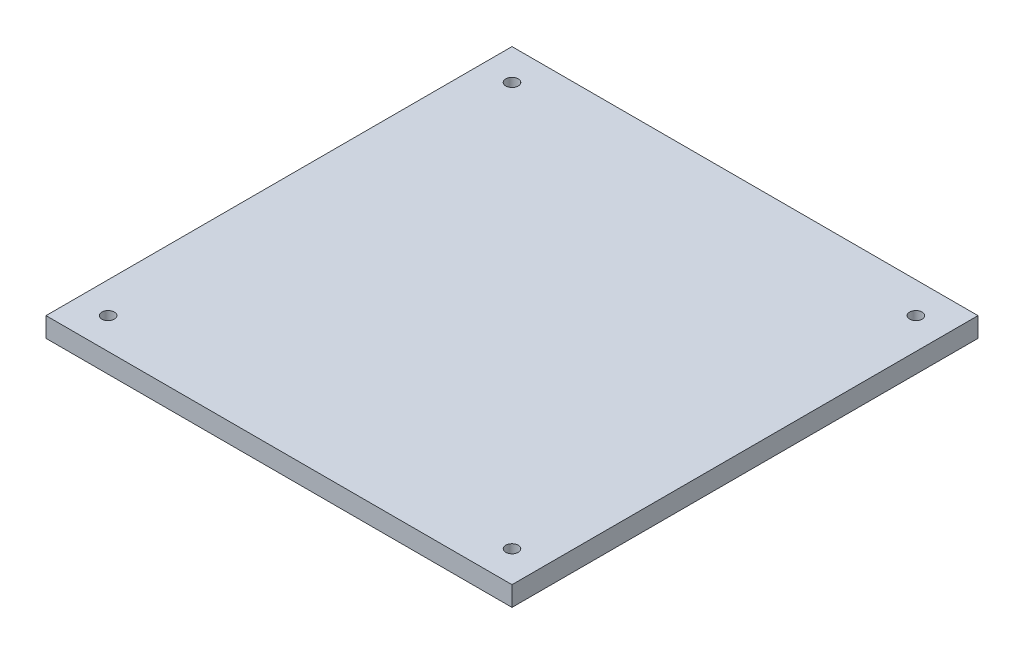
ISO-10303-21;
HEADER;
FILE_DESCRIPTION(('STEP AP214'),'2;1');
FILE_NAME('part.step','',(''),(''),'','','');
FILE_SCHEMA(('AUTOMOTIVE_DESIGN { 1 0 10303 214 1 1 1 1 }'));
ENDSEC;
DATA;
#1=APPLICATION_CONTEXT('core data for automotive mechanical design processes');
#2=APPLICATION_PROTOCOL_DEFINITION('international standard','automotive_design',2000,#1);
#3=PRODUCT_CONTEXT('',#1,'mechanical');
#4=PRODUCT('Part','Part','',(#3));
#5=PRODUCT_RELATED_PRODUCT_CATEGORY('part','',(#4));
#6=PRODUCT_DEFINITION_FORMATION('','',#4);
#7=PRODUCT_DEFINITION_CONTEXT('part definition',#1,'design');
#8=PRODUCT_DEFINITION('design','',#6,#7);
#9=PRODUCT_DEFINITION_SHAPE('','',#8);
#10=(LENGTH_UNIT() NAMED_UNIT(*) SI_UNIT(.MILLI.,.METRE.));
#11=(NAMED_UNIT(*) PLANE_ANGLE_UNIT() SI_UNIT($,.RADIAN.));
#12=(NAMED_UNIT(*) SI_UNIT($,.STERADIAN.) SOLID_ANGLE_UNIT());
#13=UNCERTAINTY_MEASURE_WITH_UNIT(LENGTH_MEASURE(1.E-05),#10,'distance_accuracy_value','');
#14=(GEOMETRIC_REPRESENTATION_CONTEXT(3) GLOBAL_UNCERTAINTY_ASSIGNED_CONTEXT((#13)) GLOBAL_UNIT_ASSIGNED_CONTEXT((#10,
#11,#12)) REPRESENTATION_CONTEXT('',''));
#15=CARTESIAN_POINT('',(0.,0.,0.));
#16=DIRECTION('',(0.,0.,1.));
#17=DIRECTION('',(1.,0.,0.));
#18=AXIS2_PLACEMENT_3D('',#15,#16,#17);
#19=CARTESIAN_POINT('',(300.,25.4,300.));
#20=DIRECTION('',(-1.,0.,0.));
#21=DIRECTION('',(0.,0.,1.));
#22=AXIS2_PLACEMENT_3D('',#19,#20,#21);
#23=PLANE('',#22);
#24=DIRECTION('',(0.,0.,-1.));
#25=VECTOR('',#24,1.);
#26=CARTESIAN_POINT('',(300.,0.,300.));
#27=LINE('',#26,#25);
#28=CARTESIAN_POINT('',(300.,0.,300.));
#29=VERTEX_POINT('',#28);
#30=CARTESIAN_POINT('',(300.,0.,-300.));
#31=VERTEX_POINT('',#30);
#32=EDGE_CURVE('E114',#29,#31,#27,.T.);
#33=ORIENTED_EDGE('',*,*,#32,.T.);
#34=DIRECTION('',(0.,-1.,0.));
#35=VECTOR('',#34,1.);
#36=CARTESIAN_POINT('',(300.,25.4,-300.));
#37=LINE('',#36,#35);
#38=CARTESIAN_POINT('',(300.,25.4,-300.));
#39=VERTEX_POINT('',#38);
#40=EDGE_CURVE('E11',#39,#31,#37,.T.);
#41=ORIENTED_EDGE('',*,*,#40,.F.);
#42=DIRECTION('',(0.,0.,-1.));
#43=VECTOR('',#42,1.);
#44=CARTESIAN_POINT('',(300.,25.4,300.));
#45=LINE('',#44,#43);
#46=CARTESIAN_POINT('',(300.,25.4,300.));
#47=VERTEX_POINT('',#46);
#48=EDGE_CURVE('E98',#47,#39,#45,.T.);
#49=ORIENTED_EDGE('',*,*,#48,.F.);
#50=DIRECTION('',(0.,-1.,0.));
#51=VECTOR('',#50,1.);
#52=CARTESIAN_POINT('',(300.,25.4,300.));
#53=LINE('',#52,#51);
#54=EDGE_CURVE('E110',#47,#29,#53,.T.);
#55=ORIENTED_EDGE('',*,*,#54,.T.);
#56=EDGE_LOOP('',(#33,#41,#49,#55));
#57=FACE_BOUND('',#56,.T.);
#58=ADVANCED_FACE('F38',(#57),#23,.F.);
#59=CARTESIAN_POINT('',(-300.,25.4,-300.));
#60=DIRECTION('',(0.,0.,1.));
#61=DIRECTION('',(1.,0.,0.));
#62=AXIS2_PLACEMENT_3D('',#59,#60,#61);
#63=PLANE('',#62);
#64=DIRECTION('',(-1.,0.,0.));
#65=VECTOR('',#64,1.);
#66=CARTESIAN_POINT('',(-300.,0.,-300.));
#67=LINE('',#66,#65);
#68=CARTESIAN_POINT('',(-300.,0.,-300.));
#69=VERTEX_POINT('',#68);
#70=EDGE_CURVE('E103',#31,#69,#67,.T.);
#71=ORIENTED_EDGE('',*,*,#70,.T.);
#72=DIRECTION('',(0.,-1.,0.));
#73=VECTOR('',#72,1.);
#74=CARTESIAN_POINT('',(-300.,25.4,-300.));
#75=LINE('',#74,#73);
#76=CARTESIAN_POINT('',(-300.,25.4,-300.));
#77=VERTEX_POINT('',#76);
#78=EDGE_CURVE('E47',#77,#69,#75,.T.);
#79=ORIENTED_EDGE('',*,*,#78,.F.);
#80=DIRECTION('',(-1.,0.,0.));
#81=VECTOR('',#80,1.);
#82=CARTESIAN_POINT('',(-300.,25.4,-300.));
#83=LINE('',#82,#81);
#84=EDGE_CURVE('E92',#39,#77,#83,.T.);
#85=ORIENTED_EDGE('',*,*,#84,.F.);
#86=ORIENTED_EDGE('',*,*,#40,.T.);
#87=EDGE_LOOP('',(#71,#79,#85,#86));
#88=FACE_BOUND('',#87,.T.);
#89=ADVANCED_FACE('F102',(#88),#63,.F.);
#90=CARTESIAN_POINT('',(-300.,25.4,300.));
#91=DIRECTION('',(1.,0.,0.));
#92=DIRECTION('',(0.,0.,-1.));
#93=AXIS2_PLACEMENT_3D('',#90,#91,#92);
#94=PLANE('',#93);
#95=DIRECTION('',(0.,0.,1.));
#96=VECTOR('',#95,1.);
#97=CARTESIAN_POINT('',(-300.,0.,300.));
#98=LINE('',#97,#96);
#99=CARTESIAN_POINT('',(-300.,0.,300.));
#100=VERTEX_POINT('',#99);
#101=EDGE_CURVE('E78',#69,#100,#98,.T.);
#102=ORIENTED_EDGE('',*,*,#101,.T.);
#103=DIRECTION('',(0.,-1.,0.));
#104=VECTOR('',#103,1.);
#105=CARTESIAN_POINT('',(-300.,25.4,300.));
#106=LINE('',#105,#104);
#107=CARTESIAN_POINT('',(-300.,25.4,300.));
#108=VERTEX_POINT('',#107);
#109=EDGE_CURVE('E105',#108,#100,#106,.T.);
#110=ORIENTED_EDGE('',*,*,#109,.F.);
#111=DIRECTION('',(0.,0.,1.));
#112=VECTOR('',#111,1.);
#113=CARTESIAN_POINT('',(-300.,25.4,300.));
#114=LINE('',#113,#112);
#115=EDGE_CURVE('E96',#77,#108,#114,.T.);
#116=ORIENTED_EDGE('',*,*,#115,.F.);
#117=ORIENTED_EDGE('',*,*,#78,.T.);
#118=EDGE_LOOP('',(#102,#110,#116,#117));
#119=FACE_BOUND('',#118,.T.);
#120=ADVANCED_FACE('F106',(#119),#94,.F.);
#121=CARTESIAN_POINT('',(-300.,25.4,300.));
#122=DIRECTION('',(0.,0.,-1.));
#123=DIRECTION('',(-1.,0.,0.));
#124=AXIS2_PLACEMENT_3D('',#121,#122,#123);
#125=PLANE('',#124);
#126=DIRECTION('',(1.,0.,0.));
#127=VECTOR('',#126,1.);
#128=CARTESIAN_POINT('',(-300.,0.,300.));
#129=LINE('',#128,#127);
#130=EDGE_CURVE('E85',#100,#29,#129,.T.);
#131=ORIENTED_EDGE('',*,*,#130,.T.);
#132=ORIENTED_EDGE('',*,*,#54,.F.);
#133=DIRECTION('',(1.,0.,0.));
#134=VECTOR('',#133,1.);
#135=CARTESIAN_POINT('',(-300.,25.4,300.));
#136=LINE('',#135,#134);
#137=EDGE_CURVE('E58',#108,#47,#136,.T.);
#138=ORIENTED_EDGE('',*,*,#137,.F.);
#139=ORIENTED_EDGE('',*,*,#109,.T.);
#140=EDGE_LOOP('',(#131,#132,#138,#139));
#141=FACE_BOUND('',#140,.T.);
#142=ADVANCED_FACE('F129',(#141),#125,.F.);
#143=CARTESIAN_POINT('',(0.,25.4,0.));
#144=DIRECTION('',(0.,-1.,0.));
#145=DIRECTION('',(0.,0.,-1.));
#146=AXIS2_PLACEMENT_3D('',#143,#144,#145);
#147=PLANE('',#146);
#148=CARTESIAN_POINT('',(-260.,25.4,-260.));
#149=DIRECTION('',(0.,1.,0.));
#150=DIRECTION('',(0.,0.,1.));
#151=AXIS2_PLACEMENT_3D('',#148,#149,#150);
#152=CIRCLE('',#151,8.00000000000001);
#153=CARTESIAN_POINT('',(-260.,25.4,-252.));
#154=VERTEX_POINT('',#153);
#155=EDGE_CURVE('E162',#154,#154,#152,.T.);
#156=ORIENTED_EDGE('',*,*,#155,.F.);
#157=EDGE_LOOP('',(#156));
#158=FACE_BOUND('',#157,.T.);
#159=CARTESIAN_POINT('',(260.,25.4,-260.));
#160=DIRECTION('',(0.,1.,0.));
#161=DIRECTION('',(0.,0.,1.));
#162=AXIS2_PLACEMENT_3D('',#159,#160,#161);
#163=CIRCLE('',#162,8.00000000000001);
#164=CARTESIAN_POINT('',(260.,25.4,-252.));
#165=VERTEX_POINT('',#164);
#166=EDGE_CURVE('E154',#165,#165,#163,.T.);
#167=ORIENTED_EDGE('',*,*,#166,.F.);
#168=EDGE_LOOP('',(#167));
#169=FACE_BOUND('',#168,.T.);
#170=CARTESIAN_POINT('',(260.,25.4,260.));
#171=DIRECTION('',(0.,1.,0.));
#172=DIRECTION('',(0.,0.,1.));
#173=AXIS2_PLACEMENT_3D('',#170,#171,#172);
#174=CIRCLE('',#173,8.00000000000001);
#175=CARTESIAN_POINT('',(260.,25.4,268.));
#176=VERTEX_POINT('',#175);
#177=EDGE_CURVE('E146',#176,#176,#174,.T.);
#178=ORIENTED_EDGE('',*,*,#177,.F.);
#179=EDGE_LOOP('',(#178));
#180=FACE_BOUND('',#179,.T.);
#181=CARTESIAN_POINT('',(-260.,25.4,260.));
#182=DIRECTION('',(0.,1.,0.));
#183=DIRECTION('',(0.,0.,1.));
#184=AXIS2_PLACEMENT_3D('',#181,#182,#183);
#185=CIRCLE('',#184,8.00000000000001);
#186=CARTESIAN_POINT('',(-260.,25.4,268.));
#187=VERTEX_POINT('',#186);
#188=EDGE_CURVE('E138',#187,#187,#185,.T.);
#189=ORIENTED_EDGE('',*,*,#188,.F.);
#190=EDGE_LOOP('',(#189));
#191=FACE_BOUND('',#190,.T.);
#192=ORIENTED_EDGE('',*,*,#48,.T.);
#193=ORIENTED_EDGE('',*,*,#84,.T.);
#194=ORIENTED_EDGE('',*,*,#115,.T.);
#195=ORIENTED_EDGE('',*,*,#137,.T.);
#196=EDGE_LOOP('',(#192,#193,#194,#195));
#197=FACE_BOUND('',#196,.T.);
#198=ADVANCED_FACE('F94',(#158,#169,#180,#191,#197),#147,.F.);
#199=CARTESIAN_POINT('',(0.,0.,0.));
#200=DIRECTION('',(0.,-1.,0.));
#201=DIRECTION('',(0.,0.,-1.));
#202=AXIS2_PLACEMENT_3D('',#199,#200,#201);
#203=PLANE('',#202);
#204=CARTESIAN_POINT('',(-260.,0.,-260.));
#205=DIRECTION('',(0.,1.,0.));
#206=DIRECTION('',(0.,0.,1.));
#207=AXIS2_PLACEMENT_3D('',#204,#205,#206);
#208=CIRCLE('',#207,8.00000000000001);
#209=CARTESIAN_POINT('',(-260.,0.,-252.));
#210=VERTEX_POINT('',#209);
#211=EDGE_CURVE('E158',#210,#210,#208,.T.);
#212=ORIENTED_EDGE('',*,*,#211,.T.);
#213=EDGE_LOOP('',(#212));
#214=FACE_BOUND('',#213,.T.);
#215=CARTESIAN_POINT('',(260.,0.,-260.));
#216=DIRECTION('',(0.,1.,0.));
#217=DIRECTION('',(0.,0.,1.));
#218=AXIS2_PLACEMENT_3D('',#215,#216,#217);
#219=CIRCLE('',#218,8.00000000000001);
#220=CARTESIAN_POINT('',(260.,0.,-252.));
#221=VERTEX_POINT('',#220);
#222=EDGE_CURVE('E150',#221,#221,#219,.T.);
#223=ORIENTED_EDGE('',*,*,#222,.T.);
#224=EDGE_LOOP('',(#223));
#225=FACE_BOUND('',#224,.T.);
#226=CARTESIAN_POINT('',(260.,0.,260.));
#227=DIRECTION('',(0.,1.,0.));
#228=DIRECTION('',(0.,0.,1.));
#229=AXIS2_PLACEMENT_3D('',#226,#227,#228);
#230=CIRCLE('',#229,8.00000000000001);
#231=CARTESIAN_POINT('',(260.,0.,268.));
#232=VERTEX_POINT('',#231);
#233=EDGE_CURVE('E142',#232,#232,#230,.T.);
#234=ORIENTED_EDGE('',*,*,#233,.T.);
#235=EDGE_LOOP('',(#234));
#236=FACE_BOUND('',#235,.T.);
#237=CARTESIAN_POINT('',(-260.,0.,260.));
#238=DIRECTION('',(0.,1.,0.));
#239=DIRECTION('',(0.,0.,1.));
#240=AXIS2_PLACEMENT_3D('',#237,#238,#239);
#241=CIRCLE('',#240,8.00000000000001);
#242=CARTESIAN_POINT('',(-260.,0.,268.));
#243=VERTEX_POINT('',#242);
#244=EDGE_CURVE('E118',#243,#243,#241,.T.);
#245=ORIENTED_EDGE('',*,*,#244,.T.);
#246=EDGE_LOOP('',(#245));
#247=FACE_BOUND('',#246,.T.);
#248=ORIENTED_EDGE('',*,*,#32,.F.);
#249=ORIENTED_EDGE('',*,*,#130,.F.);
#250=ORIENTED_EDGE('',*,*,#101,.F.);
#251=ORIENTED_EDGE('',*,*,#70,.F.);
#252=EDGE_LOOP('',(#248,#249,#250,#251));
#253=FACE_BOUND('',#252,.T.);
#254=ADVANCED_FACE('F132',(#214,#225,#236,#247,#253),#203,.T.);
#255=CARTESIAN_POINT('',(-260.,25.4,260.));
#256=DIRECTION('',(0.,1.,0.));
#257=DIRECTION('',(0.,0.,1.));
#258=AXIS2_PLACEMENT_3D('',#255,#256,#257);
#259=CYLINDRICAL_SURFACE('',#258,8.00000000000001);
#260=ORIENTED_EDGE('',*,*,#244,.F.);
#261=EDGE_LOOP('',(#260));
#262=FACE_BOUND('',#261,.T.);
#263=ORIENTED_EDGE('',*,*,#188,.T.);
#264=EDGE_LOOP('',(#263));
#265=FACE_BOUND('',#264,.T.);
#266=ADVANCED_FACE('F178',(#262,#265),#259,.F.);
#267=CARTESIAN_POINT('',(260.,25.4,260.));
#268=DIRECTION('',(0.,1.,0.));
#269=DIRECTION('',(0.,0.,1.));
#270=AXIS2_PLACEMENT_3D('',#267,#268,#269);
#271=CYLINDRICAL_SURFACE('',#270,8.00000000000001);
#272=ORIENTED_EDGE('',*,*,#233,.F.);
#273=EDGE_LOOP('',(#272));
#274=FACE_BOUND('',#273,.T.);
#275=ORIENTED_EDGE('',*,*,#177,.T.);
#276=EDGE_LOOP('',(#275));
#277=FACE_BOUND('',#276,.T.);
#278=ADVANCED_FACE('F180',(#274,#277),#271,.F.);
#279=CARTESIAN_POINT('',(260.,25.4,-260.));
#280=DIRECTION('',(0.,1.,0.));
#281=DIRECTION('',(0.,0.,1.));
#282=AXIS2_PLACEMENT_3D('',#279,#280,#281);
#283=CYLINDRICAL_SURFACE('',#282,8.00000000000001);
#284=ORIENTED_EDGE('',*,*,#222,.F.);
#285=EDGE_LOOP('',(#284));
#286=FACE_BOUND('',#285,.T.);
#287=ORIENTED_EDGE('',*,*,#166,.T.);
#288=EDGE_LOOP('',(#287));
#289=FACE_BOUND('',#288,.T.);
#290=ADVANCED_FACE('F187',(#286,#289),#283,.F.);
#291=CARTESIAN_POINT('',(-260.,25.4,-260.));
#292=DIRECTION('',(0.,1.,0.));
#293=DIRECTION('',(0.,0.,1.));
#294=AXIS2_PLACEMENT_3D('',#291,#292,#293);
#295=CYLINDRICAL_SURFACE('',#294,8.00000000000001);
#296=ORIENTED_EDGE('',*,*,#211,.F.);
#297=EDGE_LOOP('',(#296));
#298=FACE_BOUND('',#297,.T.);
#299=ORIENTED_EDGE('',*,*,#155,.T.);
#300=EDGE_LOOP('',(#299));
#301=FACE_BOUND('',#300,.T.);
#302=ADVANCED_FACE('F167',(#298,#301),#295,.F.);
#303=CLOSED_SHELL('',(#58,#89,#120,#142,#198,#254,#266,#278,#290,#302));
#304=MANIFOLD_SOLID_BREP('B2',#303);
#305=ADVANCED_BREP_SHAPE_REPRESENTATION('',(#18,#304),#14);
#306=SHAPE_DEFINITION_REPRESENTATION(#9,#305);
ENDSEC;
END-ISO-10303-21;
